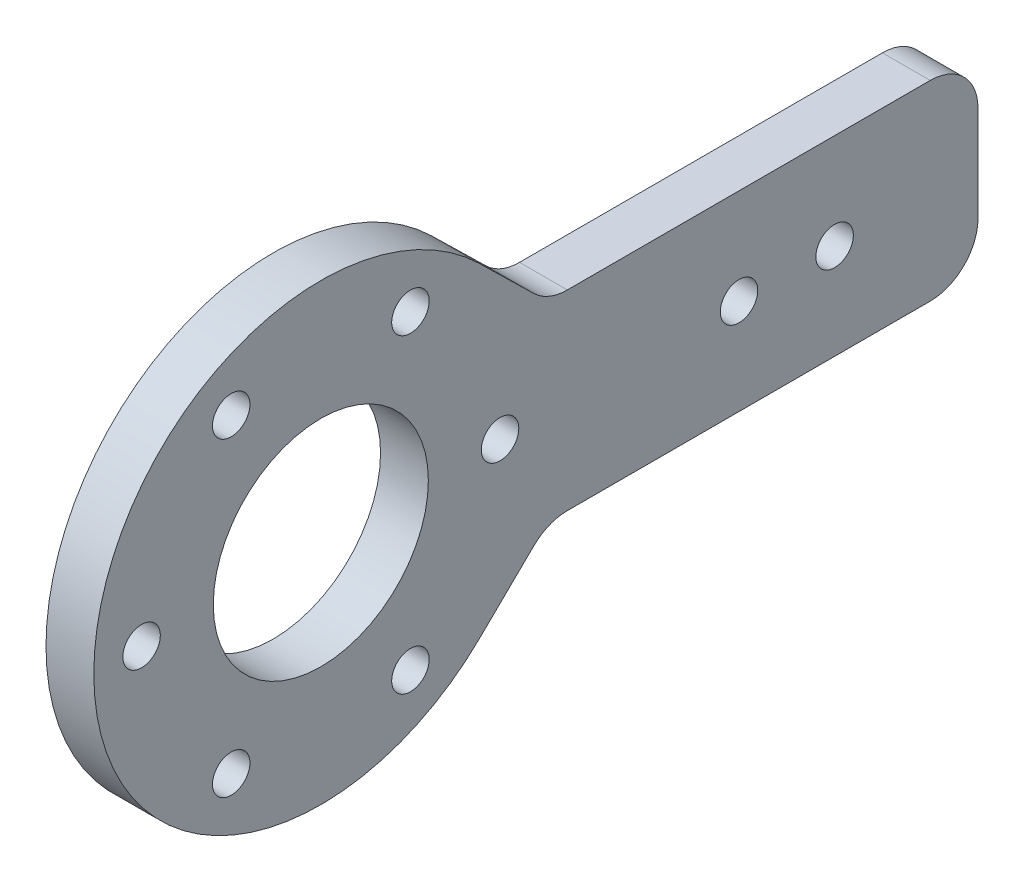
ISO-10303-21;
HEADER;
FILE_DESCRIPTION(('STEP AP214'),'2;1');
FILE_NAME('part.step','',(''),(''),'','','');
FILE_SCHEMA(('AUTOMOTIVE_DESIGN { 1 0 10303 214 1 1 1 1 }'));
ENDSEC;
DATA;
#1=APPLICATION_CONTEXT('core data for automotive mechanical design processes');
#2=APPLICATION_PROTOCOL_DEFINITION('international standard','automotive_design',2000,#1);
#3=PRODUCT_CONTEXT('',#1,'mechanical');
#4=PRODUCT('Part','Part','',(#3));
#5=PRODUCT_RELATED_PRODUCT_CATEGORY('part','',(#4));
#6=PRODUCT_DEFINITION_FORMATION('','',#4);
#7=PRODUCT_DEFINITION_CONTEXT('part definition',#1,'design');
#8=PRODUCT_DEFINITION('design','',#6,#7);
#9=PRODUCT_DEFINITION_SHAPE('','',#8);
#10=(LENGTH_UNIT() NAMED_UNIT(*) SI_UNIT(.MILLI.,.METRE.));
#11=(NAMED_UNIT(*) PLANE_ANGLE_UNIT() SI_UNIT($,.RADIAN.));
#12=(NAMED_UNIT(*) SI_UNIT($,.STERADIAN.) SOLID_ANGLE_UNIT());
#13=UNCERTAINTY_MEASURE_WITH_UNIT(LENGTH_MEASURE(1.E-05),#10,'distance_accuracy_value','');
#14=(GEOMETRIC_REPRESENTATION_CONTEXT(3) GLOBAL_UNCERTAINTY_ASSIGNED_CONTEXT((#13)) GLOBAL_UNIT_ASSIGNED_CONTEXT((#10,
#11,#12)) REPRESENTATION_CONTEXT('',''));
#15=CARTESIAN_POINT('',(0.,0.,0.));
#16=DIRECTION('',(0.,0.,1.));
#17=DIRECTION('',(1.,0.,0.));
#18=AXIS2_PLACEMENT_3D('',#15,#16,#17);
#19=CARTESIAN_POINT('',(3.175,21.5750588235294,-21.0782647058824));
#20=DIRECTION('',(0.,0.715294117647059,-0.698823529411765));
#21=DIRECTION('',(0.,0.698823529411765,0.715294117647059));
#22=AXIS2_PLACEMENT_3D('',#19,#20,#21);
#23=PLANE('',#22);
#24=DIRECTION('',(0.,-0.698823529411765,-0.715294117647059));
#25=VECTOR('',#24,1.);
#26=CARTESIAN_POINT('',(3.175,21.5750588235294,-21.0782647058824));
#27=LINE('',#26,#25);
#28=CARTESIAN_POINT('',(3.175,21.5750588235294,-21.0782647058824));
#29=VERTEX_POINT('',#28);
#30=CARTESIAN_POINT('',(3.175,14.5078823529412,-28.3120076252723));
#31=VERTEX_POINT('',#30);
#32=EDGE_CURVE('E118',#29,#31,#27,.T.);
#33=ORIENTED_EDGE('',*,*,#32,.T.);
#34=DIRECTION('',(-1.,0.,0.));
#35=VECTOR('',#34,1.);
#36=CARTESIAN_POINT('',(-3.175,14.5078823529412,-28.3120076252723));
#37=LINE('',#36,#35);
#38=CARTESIAN_POINT('',(-3.175,14.5078823529412,-28.3120076252723));
#39=VERTEX_POINT('',#38);
#40=EDGE_CURVE('E125',#31,#39,#37,.T.);
#41=ORIENTED_EDGE('',*,*,#40,.T.);
#42=DIRECTION('',(0.,-0.698823529411765,-0.715294117647059));
#43=VECTOR('',#42,1.);
#44=CARTESIAN_POINT('',(-3.175,21.5750588235294,-21.0782647058824));
#45=LINE('',#44,#43);
#46=CARTESIAN_POINT('',(-3.175,21.5750588235294,-21.0782647058824));
#47=VERTEX_POINT('',#46);
#48=EDGE_CURVE('E121',#47,#39,#45,.T.);
#49=ORIENTED_EDGE('',*,*,#48,.F.);
#50=DIRECTION('',(-1.,0.,0.));
#51=VECTOR('',#50,1.);
#52=CARTESIAN_POINT('',(3.175,21.5750588235294,-21.0782647058824));
#53=LINE('',#52,#51);
#54=EDGE_CURVE('E114',#29,#47,#53,.T.);
#55=ORIENTED_EDGE('',*,*,#54,.F.);
#56=EDGE_LOOP('',(#33,#41,#49,#55));
#57=FACE_BOUND('',#56,.T.);
#58=ADVANCED_FACE('F37',(#57),#23,.T.);
#59=CARTESIAN_POINT('',(3.175,0.,0.));
#60=DIRECTION('',(-1.,0.,0.));
#61=DIRECTION('',(0.,0.,1.));
#62=AXIS2_PLACEMENT_3D('',#59,#60,#61);
#63=CYLINDRICAL_SURFACE('',#62,30.1625);
#64=CARTESIAN_POINT('',(-3.175,0.,0.));
#65=DIRECTION('',(1.,0.,0.));
#66=DIRECTION('',(0.,0.,-1.));
#67=AXIS2_PLACEMENT_3D('',#64,#65,#66);
#68=CIRCLE('',#67,30.1625);
#69=CARTESIAN_POINT('',(-3.175,-21.5750588235294,-21.0782647058824));
#70=VERTEX_POINT('',#69);
#71=EDGE_CURVE('E184',#47,#70,#68,.T.);
#72=ORIENTED_EDGE('',*,*,#71,.T.);
#73=DIRECTION('',(-1.,0.,0.));
#74=VECTOR('',#73,1.);
#75=CARTESIAN_POINT('',(3.175,-21.5750588235294,-21.0782647058824));
#76=LINE('',#75,#74);
#77=CARTESIAN_POINT('',(3.175,-21.5750588235294,-21.0782647058824));
#78=VERTEX_POINT('',#77);
#79=EDGE_CURVE('E126',#78,#70,#76,.T.);
#80=ORIENTED_EDGE('',*,*,#79,.F.);
#81=CARTESIAN_POINT('',(3.175,0.,0.));
#82=DIRECTION('',(1.,0.,0.));
#83=DIRECTION('',(0.,0.,-1.));
#84=AXIS2_PLACEMENT_3D('',#81,#82,#83);
#85=CIRCLE('',#84,30.1625);
#86=EDGE_CURVE('E130',#29,#78,#85,.T.);
#87=ORIENTED_EDGE('',*,*,#86,.F.);
#88=ORIENTED_EDGE('',*,*,#54,.T.);
#89=EDGE_LOOP('',(#72,#80,#87,#88));
#90=FACE_BOUND('',#89,.T.);
#91=ADVANCED_FACE('F131',(#90),#63,.T.);
#92=CARTESIAN_POINT('',(3.175,-21.5750588235294,-21.0782647058824));
#93=DIRECTION('',(0.,0.715294117647059,0.698823529411765));
#94=DIRECTION('',(0.,-0.698823529411765,0.715294117647059));
#95=AXIS2_PLACEMENT_3D('',#92,#93,#94);
#96=PLANE('',#95);
#97=DIRECTION('',(0.,0.698823529411765,-0.715294117647059));
#98=VECTOR('',#97,1.);
#99=CARTESIAN_POINT('',(-3.175,-21.5750588235294,-21.0782647058824));
#100=LINE('',#99,#98);
#101=CARTESIAN_POINT('',(-3.175,-14.5078823529412,-28.3120076252723));
#102=VERTEX_POINT('',#101);
#103=EDGE_CURVE('E186',#70,#102,#100,.T.);
#104=ORIENTED_EDGE('',*,*,#103,.T.);
#105=DIRECTION('',(-1.,0.,0.));
#106=VECTOR('',#105,1.);
#107=CARTESIAN_POINT('',(3.175,-14.5078823529412,-28.3120076252723));
#108=LINE('',#107,#106);
#109=CARTESIAN_POINT('',(3.175,-14.5078823529412,-28.3120076252723));
#110=VERTEX_POINT('',#109);
#111=EDGE_CURVE('E242',#102,#110,#108,.F.);
#112=ORIENTED_EDGE('',*,*,#111,.T.);
#113=DIRECTION('',(0.,0.698823529411765,-0.715294117647059));
#114=VECTOR('',#113,1.);
#115=CARTESIAN_POINT('',(3.175,-21.5750588235294,-21.0782647058824));
#116=LINE('',#115,#114);
#117=EDGE_CURVE('E133',#78,#110,#116,.T.);
#118=ORIENTED_EDGE('',*,*,#117,.F.);
#119=ORIENTED_EDGE('',*,*,#79,.T.);
#120=EDGE_LOOP('',(#104,#112,#118,#119));
#121=FACE_BOUND('',#120,.T.);
#122=ADVANCED_FACE('F254',(#121),#96,.F.);
#123=CARTESIAN_POINT('',(3.175,-12.7,0.));
#124=DIRECTION('',(0.,1.,0.));
#125=DIRECTION('',(0.,0.,1.));
#126=AXIS2_PLACEMENT_3D('',#123,#124,#125);
#127=PLANE('',#126);
#128=DIRECTION('',(0.,0.,-1.));
#129=VECTOR('',#128,1.);
#130=CARTESIAN_POINT('',(-3.175,-12.7,0.));
#131=LINE('',#130,#129);
#132=CARTESIAN_POINT('',(-3.175,-12.7,-32.749537037037));
#133=VERTEX_POINT('',#132);
#134=CARTESIAN_POINT('',(-3.175,-12.7,-80.9625));
#135=VERTEX_POINT('',#134);
#136=EDGE_CURVE('E189',#133,#135,#131,.T.);
#137=ORIENTED_EDGE('',*,*,#136,.T.);
#138=DIRECTION('',(-1.,0.,0.));
#139=VECTOR('',#138,1.);
#140=CARTESIAN_POINT('',(3.175,-12.7,-80.9625));
#141=LINE('',#140,#139);
#142=CARTESIAN_POINT('',(3.175,-12.7,-80.9625));
#143=VERTEX_POINT('',#142);
#144=EDGE_CURVE('E52',#135,#143,#141,.F.);
#145=ORIENTED_EDGE('',*,*,#144,.T.);
#146=DIRECTION('',(0.,0.,-1.));
#147=VECTOR('',#146,1.);
#148=CARTESIAN_POINT('',(3.175,-12.7,0.));
#149=LINE('',#148,#147);
#150=CARTESIAN_POINT('',(3.175,-12.7,-32.749537037037));
#151=VERTEX_POINT('',#150);
#152=EDGE_CURVE('E149',#151,#143,#149,.T.);
#153=ORIENTED_EDGE('',*,*,#152,.F.);
#154=DIRECTION('',(-1.,0.,0.));
#155=VECTOR('',#154,1.);
#156=CARTESIAN_POINT('',(-3.175,-12.7,-32.749537037037));
#157=LINE('',#156,#155);
#158=EDGE_CURVE('E238',#151,#133,#157,.T.);
#159=ORIENTED_EDGE('',*,*,#158,.T.);
#160=EDGE_LOOP('',(#137,#145,#153,#159));
#161=FACE_BOUND('',#160,.T.);
#162=ADVANCED_FACE('F255',(#161),#127,.F.);
#163=CARTESIAN_POINT('',(3.175,0.,-87.3125));
#164=DIRECTION('',(0.,0.,1.));
#165=DIRECTION('',(1.,0.,0.));
#166=AXIS2_PLACEMENT_3D('',#163,#164,#165);
#167=PLANE('',#166);
#168=DIRECTION('',(0.,1.,0.));
#169=VECTOR('',#168,1.);
#170=CARTESIAN_POINT('',(-3.175,0.,-87.3125));
#171=LINE('',#170,#169);
#172=CARTESIAN_POINT('',(-3.175,-6.35,-87.3125));
#173=VERTEX_POINT('',#172);
#174=CARTESIAN_POINT('',(-3.175,6.35,-87.3125));
#175=VERTEX_POINT('',#174);
#176=EDGE_CURVE('E191',#173,#175,#171,.T.);
#177=ORIENTED_EDGE('',*,*,#176,.T.);
#178=DIRECTION('',(-1.,0.,0.));
#179=VECTOR('',#178,1.);
#180=CARTESIAN_POINT('',(3.175,6.35,-87.3125));
#181=LINE('',#180,#179);
#182=CARTESIAN_POINT('',(3.175,6.35,-87.3125));
#183=VERTEX_POINT('',#182);
#184=EDGE_CURVE('E232',#175,#183,#181,.F.);
#185=ORIENTED_EDGE('',*,*,#184,.T.);
#186=DIRECTION('',(0.,1.,0.));
#187=VECTOR('',#186,1.);
#188=CARTESIAN_POINT('',(3.175,0.,-87.3125));
#189=LINE('',#188,#187);
#190=CARTESIAN_POINT('',(3.175,-6.35,-87.3125));
#191=VERTEX_POINT('',#190);
#192=EDGE_CURVE('E151',#191,#183,#189,.T.);
#193=ORIENTED_EDGE('',*,*,#192,.F.);
#194=DIRECTION('',(-1.,0.,0.));
#195=VECTOR('',#194,1.);
#196=CARTESIAN_POINT('',(3.175,-6.35,-87.3125));
#197=LINE('',#196,#195);
#198=EDGE_CURVE('E229',#191,#173,#197,.T.);
#199=ORIENTED_EDGE('',*,*,#198,.T.);
#200=EDGE_LOOP('',(#177,#185,#193,#199));
#201=FACE_BOUND('',#200,.T.);
#202=ADVANCED_FACE('F263',(#201),#167,.F.);
#203=CARTESIAN_POINT('',(3.175,20.6222299276169,-11.90625));
#204=DIRECTION('',(-1.,0.,0.));
#205=DIRECTION('',(0.,0.,1.));
#206=AXIS2_PLACEMENT_3D('',#203,#204,#205);
#207=CYLINDRICAL_SURFACE('',#206,2.4892);
#208=CARTESIAN_POINT('',(3.175,20.6222299276169,-11.90625));
#209=DIRECTION('',(1.,0.,0.));
#210=DIRECTION('',(0.,0.,-1.));
#211=AXIS2_PLACEMENT_3D('',#208,#209,#210);
#212=CIRCLE('',#211,2.4892);
#213=CARTESIAN_POINT('',(3.175,20.6222299276169,-14.39545));
#214=VERTEX_POINT('',#213);
#215=EDGE_CURVE('E171',#214,#214,#212,.T.);
#216=ORIENTED_EDGE('',*,*,#215,.T.);
#217=EDGE_LOOP('',(#216));
#218=FACE_BOUND('',#217,.T.);
#219=CARTESIAN_POINT('',(-3.175,20.6222299276169,-11.90625));
#220=DIRECTION('',(1.,0.,0.));
#221=DIRECTION('',(0.,0.,-1.));
#222=AXIS2_PLACEMENT_3D('',#219,#220,#221);
#223=CIRCLE('',#222,2.4892);
#224=CARTESIAN_POINT('',(-3.175,20.6222299276169,-14.39545));
#225=VERTEX_POINT('',#224);
#226=EDGE_CURVE('E212',#225,#225,#223,.T.);
#227=ORIENTED_EDGE('',*,*,#226,.F.);
#228=EDGE_LOOP('',(#227));
#229=FACE_BOUND('',#228,.T.);
#230=ADVANCED_FACE('F320',(#218,#229),#207,.F.);
#231=CARTESIAN_POINT('',(3.175,0.,-23.8125));
#232=DIRECTION('',(-1.,0.,0.));
#233=DIRECTION('',(0.,0.,1.));
#234=AXIS2_PLACEMENT_3D('',#231,#232,#233);
#235=CYLINDRICAL_SURFACE('',#234,2.4892);
#236=CARTESIAN_POINT('',(3.175,0.,-23.8125));
#237=DIRECTION('',(1.,0.,0.));
#238=DIRECTION('',(0.,0.,-1.));
#239=AXIS2_PLACEMENT_3D('',#236,#237,#238);
#240=CIRCLE('',#239,2.4892);
#241=CARTESIAN_POINT('',(3.175,0.,-26.3017));
#242=VERTEX_POINT('',#241);
#243=EDGE_CURVE('E168',#242,#242,#240,.T.);
#244=ORIENTED_EDGE('',*,*,#243,.T.);
#245=EDGE_LOOP('',(#244));
#246=FACE_BOUND('',#245,.T.);
#247=CARTESIAN_POINT('',(-3.175,0.,-23.8125));
#248=DIRECTION('',(1.,0.,0.));
#249=DIRECTION('',(0.,0.,-1.));
#250=AXIS2_PLACEMENT_3D('',#247,#248,#249);
#251=CIRCLE('',#250,2.4892);
#252=CARTESIAN_POINT('',(-3.175,0.,-26.3017));
#253=VERTEX_POINT('',#252);
#254=EDGE_CURVE('E209',#253,#253,#251,.T.);
#255=ORIENTED_EDGE('',*,*,#254,.F.);
#256=EDGE_LOOP('',(#255));
#257=FACE_BOUND('',#256,.T.);
#258=ADVANCED_FACE('F323',(#246,#257),#235,.F.);
#259=CARTESIAN_POINT('',(3.175,-20.6222299276169,-11.90625));
#260=DIRECTION('',(-1.,0.,0.));
#261=DIRECTION('',(0.,0.,1.));
#262=AXIS2_PLACEMENT_3D('',#259,#260,#261);
#263=CYLINDRICAL_SURFACE('',#262,2.4892);
#264=CARTESIAN_POINT('',(3.175,-20.6222299276169,-11.90625));
#265=DIRECTION('',(1.,0.,0.));
#266=DIRECTION('',(0.,0.,-1.));
#267=AXIS2_PLACEMENT_3D('',#264,#265,#266);
#268=CIRCLE('',#267,2.4892);
#269=CARTESIAN_POINT('',(3.175,-20.6222299276169,-14.39545));
#270=VERTEX_POINT('',#269);
#271=EDGE_CURVE('E165',#270,#270,#268,.T.);
#272=ORIENTED_EDGE('',*,*,#271,.T.);
#273=EDGE_LOOP('',(#272));
#274=FACE_BOUND('',#273,.T.);
#275=CARTESIAN_POINT('',(-3.175,-20.6222299276169,-11.90625));
#276=DIRECTION('',(1.,0.,0.));
#277=DIRECTION('',(0.,0.,-1.));
#278=AXIS2_PLACEMENT_3D('',#275,#276,#277);
#279=CIRCLE('',#278,2.4892);
#280=CARTESIAN_POINT('',(-3.175,-20.6222299276169,-14.39545));
#281=VERTEX_POINT('',#280);
#282=EDGE_CURVE('E206',#281,#281,#279,.T.);
#283=ORIENTED_EDGE('',*,*,#282,.F.);
#284=EDGE_LOOP('',(#283));
#285=FACE_BOUND('',#284,.T.);
#286=ADVANCED_FACE('F327',(#274,#285),#263,.F.);
#287=CARTESIAN_POINT('',(3.175,-20.6222299276169,11.9062500000004));
#288=DIRECTION('',(-1.,0.,0.));
#289=DIRECTION('',(0.,0.,1.));
#290=AXIS2_PLACEMENT_3D('',#287,#288,#289);
#291=CYLINDRICAL_SURFACE('',#290,2.4892);
#292=CARTESIAN_POINT('',(3.175,-20.6222299276169,11.9062500000004));
#293=DIRECTION('',(1.,0.,0.));
#294=DIRECTION('',(0.,0.,-1.));
#295=AXIS2_PLACEMENT_3D('',#292,#293,#294);
#296=CIRCLE('',#295,2.4892);
#297=CARTESIAN_POINT('',(3.175,-20.6222299276169,9.41705000000038));
#298=VERTEX_POINT('',#297);
#299=EDGE_CURVE('E162',#298,#298,#296,.T.);
#300=ORIENTED_EDGE('',*,*,#299,.T.);
#301=EDGE_LOOP('',(#300));
#302=FACE_BOUND('',#301,.T.);
#303=CARTESIAN_POINT('',(-3.175,-20.6222299276169,11.9062500000004));
#304=DIRECTION('',(1.,0.,0.));
#305=DIRECTION('',(0.,0.,-1.));
#306=AXIS2_PLACEMENT_3D('',#303,#304,#305);
#307=CIRCLE('',#306,2.4892);
#308=CARTESIAN_POINT('',(-3.175,-20.6222299276169,9.41705000000038));
#309=VERTEX_POINT('',#308);
#310=EDGE_CURVE('E203',#309,#309,#307,.T.);
#311=ORIENTED_EDGE('',*,*,#310,.F.);
#312=EDGE_LOOP('',(#311));
#313=FACE_BOUND('',#312,.T.);
#314=ADVANCED_FACE('F331',(#302,#313),#291,.F.);
#315=CARTESIAN_POINT('',(3.175,0.,23.8125000000004));
#316=DIRECTION('',(-1.,0.,0.));
#317=DIRECTION('',(0.,0.,1.));
#318=AXIS2_PLACEMENT_3D('',#315,#316,#317);
#319=CYLINDRICAL_SURFACE('',#318,2.4892);
#320=CARTESIAN_POINT('',(3.175,0.,23.8125000000004));
#321=DIRECTION('',(1.,0.,0.));
#322=DIRECTION('',(0.,0.,-1.));
#323=AXIS2_PLACEMENT_3D('',#320,#321,#322);
#324=CIRCLE('',#323,2.4892);
#325=CARTESIAN_POINT('',(3.175,0.,21.3233000000004));
#326=VERTEX_POINT('',#325);
#327=EDGE_CURVE('E159',#326,#326,#324,.T.);
#328=ORIENTED_EDGE('',*,*,#327,.T.);
#329=EDGE_LOOP('',(#328));
#330=FACE_BOUND('',#329,.T.);
#331=CARTESIAN_POINT('',(-3.175,0.,23.8125000000004));
#332=DIRECTION('',(1.,0.,0.));
#333=DIRECTION('',(0.,0.,-1.));
#334=AXIS2_PLACEMENT_3D('',#331,#332,#333);
#335=CIRCLE('',#334,2.4892);
#336=CARTESIAN_POINT('',(-3.175,0.,21.3233000000004));
#337=VERTEX_POINT('',#336);
#338=EDGE_CURVE('E200',#337,#337,#335,.T.);
#339=ORIENTED_EDGE('',*,*,#338,.F.);
#340=EDGE_LOOP('',(#339));
#341=FACE_BOUND('',#340,.T.);
#342=ADVANCED_FACE('F335',(#330,#341),#319,.F.);
#343=CARTESIAN_POINT('',(3.175,0.,0.));
#344=DIRECTION('',(-1.,0.,0.));
#345=DIRECTION('',(0.,0.,1.));
#346=AXIS2_PLACEMENT_3D('',#343,#344,#345);
#347=CYLINDRICAL_SURFACE('',#346,14.2875);
#348=CARTESIAN_POINT('',(3.175,0.,0.));
#349=DIRECTION('',(1.,0.,0.));
#350=DIRECTION('',(0.,0.,-1.));
#351=AXIS2_PLACEMENT_3D('',#348,#349,#350);
#352=CIRCLE('',#351,14.2875);
#353=CARTESIAN_POINT('',(3.175,0.,-14.2875));
#354=VERTEX_POINT('',#353);
#355=EDGE_CURVE('E156',#354,#354,#352,.T.);
#356=ORIENTED_EDGE('',*,*,#355,.T.);
#357=EDGE_LOOP('',(#356));
#358=FACE_BOUND('',#357,.T.);
#359=CARTESIAN_POINT('',(-3.175,0.,0.));
#360=DIRECTION('',(1.,0.,0.));
#361=DIRECTION('',(0.,0.,-1.));
#362=AXIS2_PLACEMENT_3D('',#359,#360,#361);
#363=CIRCLE('',#362,14.2875);
#364=CARTESIAN_POINT('',(-3.175,0.,-14.2875));
#365=VERTEX_POINT('',#364);
#366=EDGE_CURVE('E197',#365,#365,#363,.T.);
#367=ORIENTED_EDGE('',*,*,#366,.F.);
#368=EDGE_LOOP('',(#367));
#369=FACE_BOUND('',#368,.T.);
#370=ADVANCED_FACE('F339',(#358,#369),#347,.F.);
#371=CARTESIAN_POINT('',(3.175,12.7,0.));
#372=DIRECTION('',(0.,1.,0.));
#373=DIRECTION('',(0.,0.,1.));
#374=AXIS2_PLACEMENT_3D('',#371,#372,#373);
#375=PLANE('',#374);
#376=DIRECTION('',(0.,0.,-1.));
#377=VECTOR('',#376,1.);
#378=CARTESIAN_POINT('',(-3.175,12.7,0.));
#379=LINE('',#378,#377);
#380=CARTESIAN_POINT('',(-3.175,12.7,-32.749537037037));
#381=VERTEX_POINT('',#380);
#382=CARTESIAN_POINT('',(-3.175,12.7,-80.9625));
#383=VERTEX_POINT('',#382);
#384=EDGE_CURVE('E194',#381,#383,#379,.T.);
#385=ORIENTED_EDGE('',*,*,#384,.F.);
#386=DIRECTION('',(-1.,0.,0.));
#387=VECTOR('',#386,1.);
#388=CARTESIAN_POINT('',(3.175,12.7,-32.749537037037));
#389=LINE('',#388,#387);
#390=CARTESIAN_POINT('',(3.175,12.7,-32.749537037037));
#391=VERTEX_POINT('',#390);
#392=EDGE_CURVE('E223',#381,#391,#389,.F.);
#393=ORIENTED_EDGE('',*,*,#392,.T.);
#394=DIRECTION('',(0.,0.,-1.));
#395=VECTOR('',#394,1.);
#396=CARTESIAN_POINT('',(3.175,12.7,0.));
#397=LINE('',#396,#395);
#398=CARTESIAN_POINT('',(3.175,12.7,-80.9625));
#399=VERTEX_POINT('',#398);
#400=EDGE_CURVE('E153',#391,#399,#397,.T.);
#401=ORIENTED_EDGE('',*,*,#400,.T.);
#402=DIRECTION('',(-1.,0.,0.));
#403=VECTOR('',#402,1.);
#404=CARTESIAN_POINT('',(-3.175,12.7,-80.9625));
#405=LINE('',#404,#403);
#406=EDGE_CURVE('E220',#399,#383,#405,.T.);
#407=ORIENTED_EDGE('',*,*,#406,.T.);
#408=EDGE_LOOP('',(#385,#393,#401,#407));
#409=FACE_BOUND('',#408,.T.);
#410=ADVANCED_FACE('F271',(#409),#375,.T.);
#411=CARTESIAN_POINT('',(3.175,0.,-55.5625));
#412=DIRECTION('',(-1.,0.,0.));
#413=DIRECTION('',(0.,0.,1.));
#414=AXIS2_PLACEMENT_3D('',#411,#412,#413);
#415=CYLINDRICAL_SURFACE('',#414,2.4892);
#416=CARTESIAN_POINT('',(3.175,0.,-55.5625));
#417=DIRECTION('',(1.,0.,0.));
#418=DIRECTION('',(0.,0.,-1.));
#419=AXIS2_PLACEMENT_3D('',#416,#417,#418);
#420=CIRCLE('',#419,2.4892);
#421=CARTESIAN_POINT('',(3.175,0.,-58.0517));
#422=VERTEX_POINT('',#421);
#423=EDGE_CURVE('E141',#422,#422,#420,.T.);
#424=ORIENTED_EDGE('',*,*,#423,.T.);
#425=EDGE_LOOP('',(#424));
#426=FACE_BOUND('',#425,.T.);
#427=CARTESIAN_POINT('',(-3.175,0.,-55.5625));
#428=DIRECTION('',(1.,0.,0.));
#429=DIRECTION('',(0.,0.,-1.));
#430=AXIS2_PLACEMENT_3D('',#427,#428,#429);
#431=CIRCLE('',#430,2.4892);
#432=CARTESIAN_POINT('',(-3.175,0.,-58.0517));
#433=VERTEX_POINT('',#432);
#434=EDGE_CURVE('E180',#433,#433,#431,.T.);
#435=ORIENTED_EDGE('',*,*,#434,.F.);
#436=EDGE_LOOP('',(#435));
#437=FACE_BOUND('',#436,.T.);
#438=ADVANCED_FACE('F293',(#426,#437),#415,.F.);
#439=CARTESIAN_POINT('',(3.175,0.,-68.2625));
#440=DIRECTION('',(-1.,0.,0.));
#441=DIRECTION('',(0.,0.,1.));
#442=AXIS2_PLACEMENT_3D('',#439,#440,#441);
#443=CYLINDRICAL_SURFACE('',#442,2.4892);
#444=CARTESIAN_POINT('',(3.175,0.,-68.2625));
#445=DIRECTION('',(1.,0.,0.));
#446=DIRECTION('',(0.,0.,-1.));
#447=AXIS2_PLACEMENT_3D('',#444,#445,#446);
#448=CIRCLE('',#447,2.4892);
#449=CARTESIAN_POINT('',(3.175,0.,-70.7517));
#450=VERTEX_POINT('',#449);
#451=EDGE_CURVE('E144',#450,#450,#448,.T.);
#452=ORIENTED_EDGE('',*,*,#451,.T.);
#453=EDGE_LOOP('',(#452));
#454=FACE_BOUND('',#453,.T.);
#455=CARTESIAN_POINT('',(-3.175,0.,-68.2625));
#456=DIRECTION('',(1.,0.,0.));
#457=DIRECTION('',(0.,0.,-1.));
#458=AXIS2_PLACEMENT_3D('',#455,#456,#457);
#459=CIRCLE('',#458,2.4892);
#460=CARTESIAN_POINT('',(-3.175,0.,-70.7517));
#461=VERTEX_POINT('',#460);
#462=EDGE_CURVE('E177',#461,#461,#459,.T.);
#463=ORIENTED_EDGE('',*,*,#462,.F.);
#464=EDGE_LOOP('',(#463));
#465=FACE_BOUND('',#464,.T.);
#466=ADVANCED_FACE('F295',(#454,#465),#443,.F.);
#467=CARTESIAN_POINT('',(3.175,20.6222299276169,11.9062500000004));
#468=DIRECTION('',(-1.,0.,0.));
#469=DIRECTION('',(0.,0.,1.));
#470=AXIS2_PLACEMENT_3D('',#467,#468,#469);
#471=CYLINDRICAL_SURFACE('',#470,2.4892);
#472=CARTESIAN_POINT('',(3.175,20.6222299276169,11.9062500000004));
#473=DIRECTION('',(1.,0.,0.));
#474=DIRECTION('',(0.,0.,-1.));
#475=AXIS2_PLACEMENT_3D('',#472,#473,#474);
#476=CIRCLE('',#475,2.4892);
#477=CARTESIAN_POINT('',(3.175,20.6222299276169,9.41705000000039));
#478=VERTEX_POINT('',#477);
#479=EDGE_CURVE('E174',#478,#478,#476,.T.);
#480=ORIENTED_EDGE('',*,*,#479,.T.);
#481=EDGE_LOOP('',(#480));
#482=FACE_BOUND('',#481,.T.);
#483=CARTESIAN_POINT('',(-3.175,20.6222299276169,11.9062500000004));
#484=DIRECTION('',(1.,0.,0.));
#485=DIRECTION('',(0.,0.,-1.));
#486=AXIS2_PLACEMENT_3D('',#483,#484,#485);
#487=CIRCLE('',#486,2.4892);
#488=CARTESIAN_POINT('',(-3.175,20.6222299276169,9.41705000000039));
#489=VERTEX_POINT('',#488);
#490=EDGE_CURVE('E215',#489,#489,#487,.T.);
#491=ORIENTED_EDGE('',*,*,#490,.F.);
#492=EDGE_LOOP('',(#491));
#493=FACE_BOUND('',#492,.T.);
#494=ADVANCED_FACE('F298',(#482,#493),#471,.F.);
#495=CARTESIAN_POINT('',(3.175,0.,0.));
#496=DIRECTION('',(1.,0.,0.));
#497=DIRECTION('',(0.,0.,-1.));
#498=AXIS2_PLACEMENT_3D('',#495,#496,#497);
#499=PLANE('',#498);
#500=ORIENTED_EDGE('',*,*,#451,.F.);
#501=EDGE_LOOP('',(#500));
#502=FACE_BOUND('',#501,.T.);
#503=ORIENTED_EDGE('',*,*,#423,.F.);
#504=EDGE_LOOP('',(#503));
#505=FACE_BOUND('',#504,.T.);
#506=ORIENTED_EDGE('',*,*,#192,.T.);
#507=CARTESIAN_POINT('',(3.175,6.35,-80.9625));
#508=DIRECTION('',(1.,0.,0.));
#509=DIRECTION('',(0.,0.,-1.));
#510=AXIS2_PLACEMENT_3D('',#507,#508,#509);
#511=CIRCLE('',#510,6.35);
#512=EDGE_CURVE('E236',#183,#399,#511,.T.);
#513=ORIENTED_EDGE('',*,*,#512,.T.);
#514=ORIENTED_EDGE('',*,*,#400,.F.);
#515=CARTESIAN_POINT('',(3.175,19.05,-32.749537037037));
#516=DIRECTION('',(1.,0.,0.));
#517=DIRECTION('',(0.,0.,-1.));
#518=AXIS2_PLACEMENT_3D('',#515,#516,#517);
#519=CIRCLE('',#518,6.35);
#520=EDGE_CURVE('E140',#391,#31,#519,.F.);
#521=ORIENTED_EDGE('',*,*,#520,.T.);
#522=ORIENTED_EDGE('',*,*,#32,.F.);
#523=ORIENTED_EDGE('',*,*,#86,.T.);
#524=ORIENTED_EDGE('',*,*,#117,.T.);
#525=CARTESIAN_POINT('',(3.175,-19.05,-32.749537037037));
#526=DIRECTION('',(1.,0.,0.));
#527=DIRECTION('',(0.,0.,-1.));
#528=AXIS2_PLACEMENT_3D('',#525,#526,#527);
#529=CIRCLE('',#528,6.35);
#530=EDGE_CURVE('E11',#110,#151,#529,.F.);
#531=ORIENTED_EDGE('',*,*,#530,.T.);
#532=ORIENTED_EDGE('',*,*,#152,.T.);
#533=CARTESIAN_POINT('',(3.175,-6.35,-80.9625));
#534=DIRECTION('',(1.,0.,0.));
#535=DIRECTION('',(0.,0.,-1.));
#536=AXIS2_PLACEMENT_3D('',#533,#534,#535);
#537=CIRCLE('',#536,6.35);
#538=EDGE_CURVE('E234',#143,#191,#537,.T.);
#539=ORIENTED_EDGE('',*,*,#538,.T.);
#540=EDGE_LOOP('',(#506,#513,#514,#521,#522,#523,#524,#531,#532,#539));
#541=FACE_BOUND('',#540,.T.);
#542=ORIENTED_EDGE('',*,*,#355,.F.);
#543=EDGE_LOOP('',(#542));
#544=FACE_BOUND('',#543,.T.);
#545=ORIENTED_EDGE('',*,*,#327,.F.);
#546=EDGE_LOOP('',(#545));
#547=FACE_BOUND('',#546,.T.);
#548=ORIENTED_EDGE('',*,*,#299,.F.);
#549=EDGE_LOOP('',(#548));
#550=FACE_BOUND('',#549,.T.);
#551=ORIENTED_EDGE('',*,*,#271,.F.);
#552=EDGE_LOOP('',(#551));
#553=FACE_BOUND('',#552,.T.);
#554=ORIENTED_EDGE('',*,*,#243,.F.);
#555=EDGE_LOOP('',(#554));
#556=FACE_BOUND('',#555,.T.);
#557=ORIENTED_EDGE('',*,*,#215,.F.);
#558=EDGE_LOOP('',(#557));
#559=FACE_BOUND('',#558,.T.);
#560=ORIENTED_EDGE('',*,*,#479,.F.);
#561=EDGE_LOOP('',(#560));
#562=FACE_BOUND('',#561,.T.);
#563=ADVANCED_FACE('F136',(#502,#505,#541,#544,#547,#550,#553,#556,#559,#562),#499,.T.);
#564=CARTESIAN_POINT('',(-3.175,0.,0.));
#565=DIRECTION('',(1.,0.,0.));
#566=DIRECTION('',(0.,0.,-1.));
#567=AXIS2_PLACEMENT_3D('',#564,#565,#566);
#568=PLANE('',#567);
#569=ORIENTED_EDGE('',*,*,#462,.T.);
#570=EDGE_LOOP('',(#569));
#571=FACE_BOUND('',#570,.T.);
#572=ORIENTED_EDGE('',*,*,#434,.T.);
#573=EDGE_LOOP('',(#572));
#574=FACE_BOUND('',#573,.T.);
#575=ORIENTED_EDGE('',*,*,#384,.T.);
#576=CARTESIAN_POINT('',(-3.175,6.35,-80.9625));
#577=DIRECTION('',(1.,0.,0.));
#578=DIRECTION('',(0.,0.,-1.));
#579=AXIS2_PLACEMENT_3D('',#576,#577,#578);
#580=CIRCLE('',#579,6.35);
#581=EDGE_CURVE('E227',#383,#175,#580,.F.);
#582=ORIENTED_EDGE('',*,*,#581,.T.);
#583=ORIENTED_EDGE('',*,*,#176,.F.);
#584=CARTESIAN_POINT('',(-3.175,-6.35,-80.9625));
#585=DIRECTION('',(1.,0.,0.));
#586=DIRECTION('',(0.,0.,-1.));
#587=AXIS2_PLACEMENT_3D('',#584,#585,#586);
#588=CIRCLE('',#587,6.35);
#589=EDGE_CURVE('E225',#173,#135,#588,.F.);
#590=ORIENTED_EDGE('',*,*,#589,.T.);
#591=ORIENTED_EDGE('',*,*,#136,.F.);
#592=CARTESIAN_POINT('',(-3.175,-19.05,-32.749537037037));
#593=DIRECTION('',(1.,0.,0.));
#594=DIRECTION('',(0.,0.,-1.));
#595=AXIS2_PLACEMENT_3D('',#592,#593,#594);
#596=CIRCLE('',#595,6.35);
#597=EDGE_CURVE('E45',#133,#102,#596,.T.);
#598=ORIENTED_EDGE('',*,*,#597,.T.);
#599=ORIENTED_EDGE('',*,*,#103,.F.);
#600=ORIENTED_EDGE('',*,*,#71,.F.);
#601=ORIENTED_EDGE('',*,*,#48,.T.);
#602=CARTESIAN_POINT('',(-3.175,19.05,-32.749537037037));
#603=DIRECTION('',(1.,0.,0.));
#604=DIRECTION('',(0.,0.,-1.));
#605=AXIS2_PLACEMENT_3D('',#602,#603,#604);
#606=CIRCLE('',#605,6.35);
#607=EDGE_CURVE('E244',#39,#381,#606,.T.);
#608=ORIENTED_EDGE('',*,*,#607,.T.);
#609=EDGE_LOOP('',(#575,#582,#583,#590,#591,#598,#599,#600,#601,#608));
#610=FACE_BOUND('',#609,.T.);
#611=ORIENTED_EDGE('',*,*,#366,.T.);
#612=EDGE_LOOP('',(#611));
#613=FACE_BOUND('',#612,.T.);
#614=ORIENTED_EDGE('',*,*,#338,.T.);
#615=EDGE_LOOP('',(#614));
#616=FACE_BOUND('',#615,.T.);
#617=ORIENTED_EDGE('',*,*,#310,.T.);
#618=EDGE_LOOP('',(#617));
#619=FACE_BOUND('',#618,.T.);
#620=ORIENTED_EDGE('',*,*,#282,.T.);
#621=EDGE_LOOP('',(#620));
#622=FACE_BOUND('',#621,.T.);
#623=ORIENTED_EDGE('',*,*,#254,.T.);
#624=EDGE_LOOP('',(#623));
#625=FACE_BOUND('',#624,.T.);
#626=ORIENTED_EDGE('',*,*,#226,.T.);
#627=EDGE_LOOP('',(#626));
#628=FACE_BOUND('',#627,.T.);
#629=ORIENTED_EDGE('',*,*,#490,.T.);
#630=EDGE_LOOP('',(#629));
#631=FACE_BOUND('',#630,.T.);
#632=ADVANCED_FACE('F248',(#571,#574,#610,#613,#616,#619,#622,#625,#628,#631),#568,.F.);
#633=CARTESIAN_POINT('',(3.175,19.05,-32.749537037037));
#634=DIRECTION('',(1.,0.,0.));
#635=DIRECTION('',(0.,0.,-1.));
#636=AXIS2_PLACEMENT_3D('',#633,#634,#635);
#637=CYLINDRICAL_SURFACE('',#636,6.35);
#638=ORIENTED_EDGE('',*,*,#520,.F.);
#639=ORIENTED_EDGE('',*,*,#392,.F.);
#640=ORIENTED_EDGE('',*,*,#607,.F.);
#641=ORIENTED_EDGE('',*,*,#40,.F.);
#642=EDGE_LOOP('',(#638,#639,#640,#641));
#643=FACE_BOUND('',#642,.T.);
#644=ADVANCED_FACE('F274',(#643),#637,.F.);
#645=CARTESIAN_POINT('',(3.175,6.35,-80.9625));
#646=DIRECTION('',(1.,0.,0.));
#647=DIRECTION('',(0.,0.,-1.));
#648=AXIS2_PLACEMENT_3D('',#645,#646,#647);
#649=CYLINDRICAL_SURFACE('',#648,6.35);
#650=ORIENTED_EDGE('',*,*,#512,.F.);
#651=ORIENTED_EDGE('',*,*,#184,.F.);
#652=ORIENTED_EDGE('',*,*,#581,.F.);
#653=ORIENTED_EDGE('',*,*,#406,.F.);
#654=EDGE_LOOP('',(#650,#651,#652,#653));
#655=FACE_BOUND('',#654,.T.);
#656=ADVANCED_FACE('F269',(#655),#649,.T.);
#657=CARTESIAN_POINT('',(3.175,-6.35,-80.9625));
#658=DIRECTION('',(-1.,0.,0.));
#659=DIRECTION('',(0.,0.,1.));
#660=AXIS2_PLACEMENT_3D('',#657,#658,#659);
#661=CYLINDRICAL_SURFACE('',#660,6.35);
#662=ORIENTED_EDGE('',*,*,#538,.F.);
#663=ORIENTED_EDGE('',*,*,#144,.F.);
#664=ORIENTED_EDGE('',*,*,#589,.F.);
#665=ORIENTED_EDGE('',*,*,#198,.F.);
#666=EDGE_LOOP('',(#662,#663,#664,#665));
#667=FACE_BOUND('',#666,.T.);
#668=ADVANCED_FACE('F260',(#667),#661,.T.);
#669=CARTESIAN_POINT('',(3.175,-19.05,-32.749537037037));
#670=DIRECTION('',(1.,0.,0.));
#671=DIRECTION('',(0.,0.,-1.));
#672=AXIS2_PLACEMENT_3D('',#669,#670,#671);
#673=CYLINDRICAL_SURFACE('',#672,6.35);
#674=ORIENTED_EDGE('',*,*,#530,.F.);
#675=ORIENTED_EDGE('',*,*,#111,.F.);
#676=ORIENTED_EDGE('',*,*,#597,.F.);
#677=ORIENTED_EDGE('',*,*,#158,.F.);
#678=EDGE_LOOP('',(#674,#675,#676,#677));
#679=FACE_BOUND('',#678,.T.);
#680=ADVANCED_FACE('F39',(#679),#673,.F.);
#681=CLOSED_SHELL('',(#58,#91,#122,#162,#202,#230,#258,#286,#314,#342,#370,#410,#438,#466,#494,
#563,#632,#644,#656,#668,#680));
#682=MANIFOLD_SOLID_BREP('B2',#681);
#683=ADVANCED_BREP_SHAPE_REPRESENTATION('',(#18,#682),#14);
#684=SHAPE_DEFINITION_REPRESENTATION(#9,#683);
ENDSEC;
END-ISO-10303-21;
